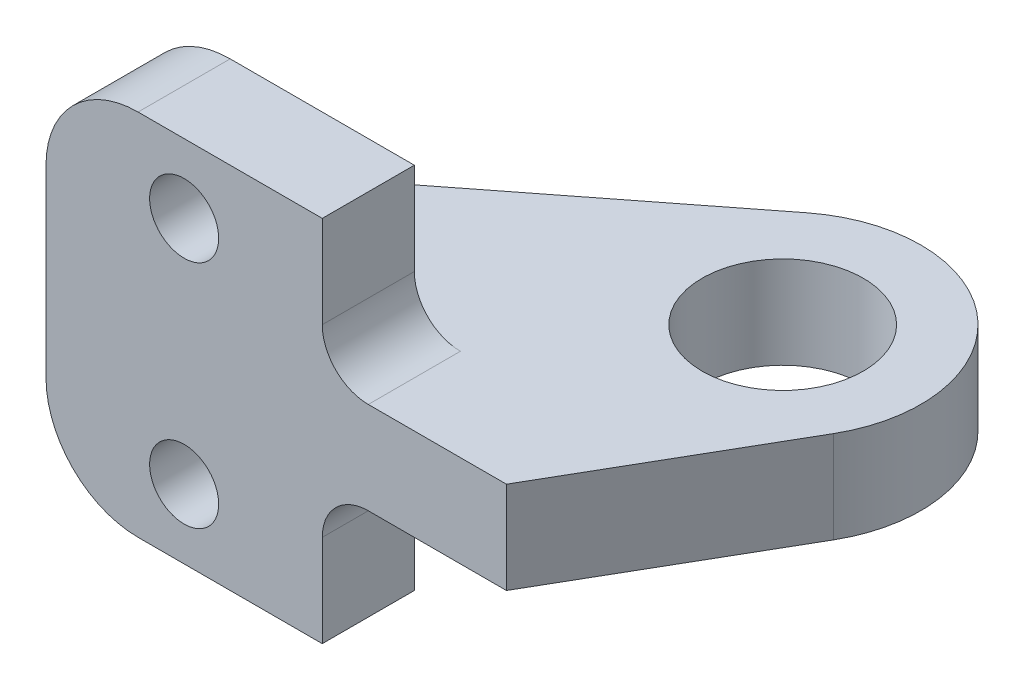
ISO-10303-21;
HEADER;
FILE_DESCRIPTION(('STEP AP214'),'2;1');
FILE_NAME('part.step','',(''),(''),'','','');
FILE_SCHEMA(('AUTOMOTIVE_DESIGN { 1 0 10303 214 1 1 1 1 }'));
ENDSEC;
DATA;
#1=APPLICATION_CONTEXT('core data for automotive mechanical design processes');
#2=APPLICATION_PROTOCOL_DEFINITION('international standard','automotive_design',2000,#1);
#3=PRODUCT_CONTEXT('',#1,'mechanical');
#4=PRODUCT('Part','Part','',(#3));
#5=PRODUCT_RELATED_PRODUCT_CATEGORY('part','',(#4));
#6=PRODUCT_DEFINITION_FORMATION('','',#4);
#7=PRODUCT_DEFINITION_CONTEXT('part definition',#1,'design');
#8=PRODUCT_DEFINITION('design','',#6,#7);
#9=PRODUCT_DEFINITION_SHAPE('','',#8);
#10=(LENGTH_UNIT() NAMED_UNIT(*) SI_UNIT(.MILLI.,.METRE.));
#11=(NAMED_UNIT(*) PLANE_ANGLE_UNIT() SI_UNIT($,.RADIAN.));
#12=(NAMED_UNIT(*) SI_UNIT($,.STERADIAN.) SOLID_ANGLE_UNIT());
#13=UNCERTAINTY_MEASURE_WITH_UNIT(LENGTH_MEASURE(1.E-05),#10,'distance_accuracy_value','');
#14=(GEOMETRIC_REPRESENTATION_CONTEXT(3) GLOBAL_UNCERTAINTY_ASSIGNED_CONTEXT((#13)) GLOBAL_UNIT_ASSIGNED_CONTEXT((#10,
#11,#12)) REPRESENTATION_CONTEXT('',''));
#15=CARTESIAN_POINT('',(0.,0.,0.));
#16=DIRECTION('',(0.,0.,1.));
#17=DIRECTION('',(1.,0.,0.));
#18=AXIS2_PLACEMENT_3D('',#15,#16,#17);
#19=CARTESIAN_POINT('',(0.,12.7,0.));
#20=DIRECTION('',(0.,0.,-1.));
#21=DIRECTION('',(-1.,0.,0.));
#22=AXIS2_PLACEMENT_3D('',#19,#20,#21);
#23=PLANE('',#22);
#24=CARTESIAN_POINT('',(38.1,-31.75,0.));
#25=DIRECTION('',(0.,0.,-1.));
#26=DIRECTION('',(-1.,0.,0.));
#27=AXIS2_PLACEMENT_3D('',#24,#25,#26);
#28=CIRCLE('',#27,9.525);
#29=CARTESIAN_POINT('',(28.575,-31.75,0.));
#30=VERTEX_POINT('',#29);
#31=EDGE_CURVE('E176',#30,#30,#28,.T.);
#32=ORIENTED_EDGE('',*,*,#31,.T.);
#33=EDGE_LOOP('',(#32));
#34=FACE_BOUND('',#33,.T.);
#35=CARTESIAN_POINT('',(38.1,31.75,0.));
#36=DIRECTION('',(0.,0.,-1.));
#37=DIRECTION('',(-1.,0.,0.));
#38=AXIS2_PLACEMENT_3D('',#35,#36,#37);
#39=CIRCLE('',#38,9.525);
#40=CARTESIAN_POINT('',(28.575,31.75,0.));
#41=VERTEX_POINT('',#40);
#42=EDGE_CURVE('E199',#41,#41,#39,.T.);
#43=ORIENTED_EDGE('',*,*,#42,.T.);
#44=EDGE_LOOP('',(#43));
#45=FACE_BOUND('',#44,.T.);
#46=DIRECTION('',(0.,-1.,0.));
#47=VECTOR('',#46,1.);
#48=CARTESIAN_POINT('',(0.,12.7,0.));
#49=LINE('',#48,#47);
#50=CARTESIAN_POINT('',(0.,25.4,0.));
#51=VERTEX_POINT('',#50);
#52=CARTESIAN_POINT('',(0.,-25.4,0.));
#53=VERTEX_POINT('',#52);
#54=EDGE_CURVE('E283',#51,#53,#49,.T.);
#55=ORIENTED_EDGE('',*,*,#54,.T.);
#56=CARTESIAN_POINT('',(25.4,-25.4,0.));
#57=DIRECTION('',(0.,0.,-1.));
#58=DIRECTION('',(-1.,0.,0.));
#59=AXIS2_PLACEMENT_3D('',#56,#57,#58);
#60=CIRCLE('',#59,25.4);
#61=CARTESIAN_POINT('',(25.4,-50.8,0.));
#62=VERTEX_POINT('',#61);
#63=EDGE_CURVE('E11',#53,#62,#60,.F.);
#64=ORIENTED_EDGE('',*,*,#63,.T.);
#65=DIRECTION('',(-1.,0.,0.));
#66=VECTOR('',#65,1.);
#67=CARTESIAN_POINT('',(0.,-50.8,0.));
#68=LINE('',#67,#66);
#69=CARTESIAN_POINT('',(76.2,-50.8,0.));
#70=VERTEX_POINT('',#69);
#71=EDGE_CURVE('E165',#70,#62,#68,.T.);
#72=ORIENTED_EDGE('',*,*,#71,.F.);
#73=DIRECTION('',(0.,-1.,0.));
#74=VECTOR('',#73,1.);
#75=CARTESIAN_POINT('',(76.2,0.,0.));
#76=LINE('',#75,#74);
#77=CARTESIAN_POINT('',(76.2,-25.4,0.));
#78=VERTEX_POINT('',#77);
#79=EDGE_CURVE('E146',#78,#70,#76,.T.);
#80=ORIENTED_EDGE('',*,*,#79,.F.);
#81=CARTESIAN_POINT('',(88.9,-25.4,0.));
#82=DIRECTION('',(0.,0.,-1.));
#83=DIRECTION('',(-1.,0.,0.));
#84=AXIS2_PLACEMENT_3D('',#81,#82,#83);
#85=CIRCLE('',#84,12.7);
#86=CARTESIAN_POINT('',(88.9,-12.7,0.));
#87=VERTEX_POINT('',#86);
#88=EDGE_CURVE('E155',#78,#87,#85,.T.);
#89=ORIENTED_EDGE('',*,*,#88,.T.);
#90=DIRECTION('',(1.,0.,0.));
#91=VECTOR('',#90,1.);
#92=CARTESIAN_POINT('',(0.,-12.7,0.));
#93=LINE('',#92,#91);
#94=CARTESIAN_POINT('',(127.,-12.7,0.));
#95=VERTEX_POINT('',#94);
#96=EDGE_CURVE('E274',#87,#95,#93,.T.);
#97=ORIENTED_EDGE('',*,*,#96,.T.);
#98=DIRECTION('',(0.,-1.,0.));
#99=VECTOR('',#98,1.);
#100=CARTESIAN_POINT('',(127.,12.7,0.));
#101=LINE('',#100,#99);
#102=CARTESIAN_POINT('',(127.,12.7,0.));
#103=VERTEX_POINT('',#102);
#104=EDGE_CURVE('E262',#103,#95,#101,.T.);
#105=ORIENTED_EDGE('',*,*,#104,.F.);
#106=DIRECTION('',(1.,0.,0.));
#107=VECTOR('',#106,1.);
#108=CARTESIAN_POINT('',(0.,12.7,0.));
#109=LINE('',#108,#107);
#110=CARTESIAN_POINT('',(88.9,12.7,0.));
#111=VERTEX_POINT('',#110);
#112=EDGE_CURVE('E255',#111,#103,#109,.T.);
#113=ORIENTED_EDGE('',*,*,#112,.F.);
#114=CARTESIAN_POINT('',(88.9,25.4,0.));
#115=DIRECTION('',(0.,0.,-1.));
#116=DIRECTION('',(-1.,0.,0.));
#117=AXIS2_PLACEMENT_3D('',#114,#115,#116);
#118=CIRCLE('',#117,12.7);
#119=CARTESIAN_POINT('',(76.2,25.4,0.));
#120=VERTEX_POINT('',#119);
#121=EDGE_CURVE('E204',#111,#120,#118,.T.);
#122=ORIENTED_EDGE('',*,*,#121,.T.);
#123=DIRECTION('',(0.,1.,0.));
#124=VECTOR('',#123,1.);
#125=CARTESIAN_POINT('',(76.2,0.,0.));
#126=LINE('',#125,#124);
#127=CARTESIAN_POINT('',(76.2,50.8,0.));
#128=VERTEX_POINT('',#127);
#129=EDGE_CURVE('E208',#120,#128,#126,.T.);
#130=ORIENTED_EDGE('',*,*,#129,.T.);
#131=DIRECTION('',(1.,0.,0.));
#132=VECTOR('',#131,1.);
#133=CARTESIAN_POINT('',(0.,50.8,0.));
#134=LINE('',#133,#132);
#135=CARTESIAN_POINT('',(25.4,50.8,0.));
#136=VERTEX_POINT('',#135);
#137=EDGE_CURVE('E229',#136,#128,#134,.T.);
#138=ORIENTED_EDGE('',*,*,#137,.F.);
#139=CARTESIAN_POINT('',(25.4,25.4,0.));
#140=DIRECTION('',(0.,0.,-1.));
#141=DIRECTION('',(-1.,0.,0.));
#142=AXIS2_PLACEMENT_3D('',#139,#140,#141);
#143=CIRCLE('',#142,25.4);
#144=EDGE_CURVE('E301',#136,#51,#143,.F.);
#145=ORIENTED_EDGE('',*,*,#144,.T.);
#146=EDGE_LOOP('',(#55,#64,#72,#80,#89,#97,#105,#113,#122,#130,#138,#145));
#147=FACE_BOUND('',#146,.T.);
#148=ADVANCED_FACE('F41',(#34,#45,#147),#23,.F.);
#149=CARTESIAN_POINT('',(0.,-50.8,-25.4));
#150=DIRECTION('',(0.,0.,1.));
#151=DIRECTION('',(1.,0.,0.));
#152=AXIS2_PLACEMENT_3D('',#149,#150,#151);
#153=PLANE('',#152);
#154=CARTESIAN_POINT('',(38.1,-31.75,-25.4));
#155=DIRECTION('',(0.,0.,-1.));
#156=DIRECTION('',(-1.,0.,0.));
#157=AXIS2_PLACEMENT_3D('',#154,#155,#156);
#158=CIRCLE('',#157,9.525);
#159=CARTESIAN_POINT('',(28.575,-31.75,-25.4));
#160=VERTEX_POINT('',#159);
#161=EDGE_CURVE('E172',#160,#160,#158,.T.);
#162=ORIENTED_EDGE('',*,*,#161,.F.);
#163=EDGE_LOOP('',(#162));
#164=FACE_BOUND('',#163,.T.);
#165=DIRECTION('',(1.,0.,0.));
#166=VECTOR('',#165,1.);
#167=CARTESIAN_POINT('',(0.,-50.8,-25.4));
#168=LINE('',#167,#166);
#169=CARTESIAN_POINT('',(25.4,-50.8,-25.4));
#170=VERTEX_POINT('',#169);
#171=CARTESIAN_POINT('',(76.2,-50.8,-25.4));
#172=VERTEX_POINT('',#171);
#173=EDGE_CURVE('E184',#170,#172,#168,.T.);
#174=ORIENTED_EDGE('',*,*,#173,.F.);
#175=CARTESIAN_POINT('',(25.4,-25.4,-25.4));
#176=DIRECTION('',(0.,0.,1.));
#177=DIRECTION('',(1.,0.,0.));
#178=AXIS2_PLACEMENT_3D('',#175,#176,#177);
#179=CIRCLE('',#178,25.4);
#180=CARTESIAN_POINT('',(0.,-25.4,-25.4));
#181=VERTEX_POINT('',#180);
#182=EDGE_CURVE('E64',#170,#181,#179,.F.);
#183=ORIENTED_EDGE('',*,*,#182,.T.);
#184=DIRECTION('',(0.,1.,0.));
#185=VECTOR('',#184,1.);
#186=CARTESIAN_POINT('',(0.,-50.8,-25.4));
#187=LINE('',#186,#185);
#188=CARTESIAN_POINT('',(0.,-12.7,-25.4));
#189=VERTEX_POINT('',#188);
#190=EDGE_CURVE('E189',#181,#189,#187,.T.);
#191=ORIENTED_EDGE('',*,*,#190,.T.);
#192=DIRECTION('',(1.,0.,0.));
#193=VECTOR('',#192,1.);
#194=CARTESIAN_POINT('',(0.,-12.7,-25.4));
#195=LINE('',#194,#193);
#196=CARTESIAN_POINT('',(88.9,-12.7,-25.4));
#197=VERTEX_POINT('',#196);
#198=EDGE_CURVE('E181',#189,#197,#195,.T.);
#199=ORIENTED_EDGE('',*,*,#198,.T.);
#200=CARTESIAN_POINT('',(88.9,-25.4,-25.4));
#201=DIRECTION('',(0.,0.,-1.));
#202=DIRECTION('',(-1.,0.,0.));
#203=AXIS2_PLACEMENT_3D('',#200,#201,#202);
#204=CIRCLE('',#203,12.7);
#205=CARTESIAN_POINT('',(76.2,-25.4,-25.4));
#206=VERTEX_POINT('',#205);
#207=EDGE_CURVE('E167',#206,#197,#204,.T.);
#208=ORIENTED_EDGE('',*,*,#207,.F.);
#209=DIRECTION('',(0.,-1.,0.));
#210=VECTOR('',#209,1.);
#211=CARTESIAN_POINT('',(76.2,0.,-25.4));
#212=LINE('',#211,#210);
#213=EDGE_CURVE('E149',#206,#172,#212,.T.);
#214=ORIENTED_EDGE('',*,*,#213,.T.);
#215=EDGE_LOOP('',(#174,#183,#191,#199,#208,#214));
#216=FACE_BOUND('',#215,.T.);
#217=ADVANCED_FACE('F321',(#164,#216),#153,.F.);
#218=CARTESIAN_POINT('',(0.,-50.8,0.));
#219=DIRECTION('',(0.,1.,0.));
#220=DIRECTION('',(0.,0.,1.));
#221=AXIS2_PLACEMENT_3D('',#218,#219,#220);
#222=PLANE('',#221);
#223=ORIENTED_EDGE('',*,*,#71,.T.);
#224=DIRECTION('',(0.,0.,-1.));
#225=VECTOR('',#224,1.);
#226=CARTESIAN_POINT('',(25.4,-50.8,-25.4));
#227=LINE('',#226,#225);
#228=EDGE_CURVE('E310',#62,#170,#227,.T.);
#229=ORIENTED_EDGE('',*,*,#228,.T.);
#230=ORIENTED_EDGE('',*,*,#173,.T.);
#231=DIRECTION('',(0.,0.,-1.));
#232=VECTOR('',#231,1.);
#233=CARTESIAN_POINT('',(76.2,-50.8,0.));
#234=LINE('',#233,#232);
#235=EDGE_CURVE('E178',#70,#172,#234,.T.);
#236=ORIENTED_EDGE('',*,*,#235,.F.);
#237=EDGE_LOOP('',(#223,#229,#230,#236));
#238=FACE_BOUND('',#237,.T.);
#239=ADVANCED_FACE('F318',(#238),#222,.F.);
#240=CARTESIAN_POINT('',(0.,-12.7,0.));
#241=DIRECTION('',(0.,1.,0.));
#242=DIRECTION('',(0.,0.,1.));
#243=AXIS2_PLACEMENT_3D('',#240,#241,#242);
#244=PLANE('',#243);
#245=CARTESIAN_POINT('',(127.,-12.7,-76.2));
#246=DIRECTION('',(0.,1.,0.));
#247=DIRECTION('',(0.,0.,1.));
#248=AXIS2_PLACEMENT_3D('',#245,#246,#247);
#249=CIRCLE('',#248,22.225);
#250=CARTESIAN_POINT('',(127.,-12.7,-53.975));
#251=VERTEX_POINT('',#250);
#252=EDGE_CURVE('E248',#251,#251,#249,.T.);
#253=ORIENTED_EDGE('',*,*,#252,.T.);
#254=EDGE_LOOP('',(#253));
#255=FACE_BOUND('',#254,.T.);
#256=ORIENTED_EDGE('',*,*,#96,.F.);
#257=DIRECTION('',(0.,0.,-1.));
#258=VECTOR('',#257,1.);
#259=CARTESIAN_POINT('',(88.9,-12.7,0.));
#260=LINE('',#259,#258);
#261=EDGE_CURVE('E154',#87,#197,#260,.T.);
#262=ORIENTED_EDGE('',*,*,#261,.T.);
#263=ORIENTED_EDGE('',*,*,#198,.F.);
#264=DIRECTION('',(0.788282795930052,0.,-0.615313118372021));
#265=VECTOR('',#264,1.);
#266=CARTESIAN_POINT('',(-12.3200349311975,-12.7,-15.7833000655262));
#267=LINE('',#266,#265);
#268=CARTESIAN_POINT('',(103.556570190026,-12.7,-106.233574524935));
#269=VERTEX_POINT('',#268);
#270=EDGE_CURVE('E270',#189,#269,#267,.T.);
#271=ORIENTED_EDGE('',*,*,#270,.T.);
#272=CARTESIAN_POINT('',(127.,-12.7,-76.2));
#273=DIRECTION('',(0.,1.,0.));
#274=DIRECTION('',(0.,0.,1.));
#275=AXIS2_PLACEMENT_3D('',#272,#273,#274);
#276=CIRCLE('',#275,38.1);
#277=CARTESIAN_POINT('',(159.995567884187,-12.7,-57.15));
#278=VERTEX_POINT('',#277);
#279=EDGE_CURVE('E266',#278,#269,#276,.T.);
#280=ORIENTED_EDGE('',*,*,#279,.F.);
#281=DIRECTION('',(0.5,0.,-0.866025403784439));
#282=VECTOR('',#281,1.);
#283=CARTESIAN_POINT('',(95.25,-12.7,54.9926131403119));
#284=LINE('',#283,#282);
#285=EDGE_CURVE('E242',#95,#278,#284,.T.);
#286=ORIENTED_EDGE('',*,*,#285,.F.);
#287=EDGE_LOOP('',(#256,#262,#263,#271,#280,#286));
#288=FACE_BOUND('',#287,.T.);
#289=ADVANCED_FACE('F324',(#255,#288),#244,.F.);
#290=CARTESIAN_POINT('',(95.25,12.7,54.9926131403119));
#291=DIRECTION('',(-0.866025403784439,0.,-0.5));
#292=DIRECTION('',(-0.5,0.,0.866025403784439));
#293=AXIS2_PLACEMENT_3D('',#290,#291,#292);
#294=PLANE('',#293);
#295=ORIENTED_EDGE('',*,*,#285,.T.);
#296=DIRECTION('',(0.,-1.,0.));
#297=VECTOR('',#296,1.);
#298=CARTESIAN_POINT('',(159.995567884187,12.7,-57.15));
#299=LINE('',#298,#297);
#300=CARTESIAN_POINT('',(159.995567884187,12.7,-57.15));
#301=VERTEX_POINT('',#300);
#302=EDGE_CURVE('E293',#301,#278,#299,.T.);
#303=ORIENTED_EDGE('',*,*,#302,.F.);
#304=DIRECTION('',(0.5,0.,-0.866025403784439));
#305=VECTOR('',#304,1.);
#306=CARTESIAN_POINT('',(95.25,12.7,54.9926131403119));
#307=LINE('',#306,#305);
#308=EDGE_CURVE('E243',#103,#301,#307,.T.);
#309=ORIENTED_EDGE('',*,*,#308,.F.);
#310=ORIENTED_EDGE('',*,*,#104,.T.);
#311=EDGE_LOOP('',(#295,#303,#309,#310));
#312=FACE_BOUND('',#311,.T.);
#313=ADVANCED_FACE('F338',(#312),#294,.F.);
#314=CARTESIAN_POINT('',(127.,12.7,-76.2));
#315=DIRECTION('',(0.,-1.,0.));
#316=DIRECTION('',(0.,0.,-1.));
#317=AXIS2_PLACEMENT_3D('',#314,#315,#316);
#318=CYLINDRICAL_SURFACE('',#317,38.1);
#319=ORIENTED_EDGE('',*,*,#279,.T.);
#320=DIRECTION('',(0.,-1.,0.));
#321=VECTOR('',#320,1.);
#322=CARTESIAN_POINT('',(103.556570190026,12.7,-106.233574524935));
#323=LINE('',#322,#321);
#324=CARTESIAN_POINT('',(103.556570190026,12.7,-106.233574524935));
#325=VERTEX_POINT('',#324);
#326=EDGE_CURVE('E290',#325,#269,#323,.T.);
#327=ORIENTED_EDGE('',*,*,#326,.F.);
#328=CARTESIAN_POINT('',(127.,12.7,-76.2));
#329=DIRECTION('',(0.,1.,0.));
#330=DIRECTION('',(0.,0.,1.));
#331=AXIS2_PLACEMENT_3D('',#328,#329,#330);
#332=CIRCLE('',#331,38.1);
#333=EDGE_CURVE('E247',#301,#325,#332,.T.);
#334=ORIENTED_EDGE('',*,*,#333,.F.);
#335=ORIENTED_EDGE('',*,*,#302,.T.);
#336=EDGE_LOOP('',(#319,#327,#334,#335));
#337=FACE_BOUND('',#336,.T.);
#338=ADVANCED_FACE('F334',(#337),#318,.T.);
#339=CARTESIAN_POINT('',(-12.3200349311975,12.7,-15.7833000655262));
#340=DIRECTION('',(-0.615313118372021,0.,-0.788282795930052));
#341=DIRECTION('',(-0.788282795930052,0.,0.615313118372021));
#342=AXIS2_PLACEMENT_3D('',#339,#340,#341);
#343=PLANE('',#342);
#344=ORIENTED_EDGE('',*,*,#270,.F.);
#345=DIRECTION('',(0.,-1.,0.));
#346=VECTOR('',#345,1.);
#347=CARTESIAN_POINT('',(0.,12.7,-25.4));
#348=LINE('',#347,#346);
#349=CARTESIAN_POINT('',(0.,12.7,-25.4));
#350=VERTEX_POINT('',#349);
#351=EDGE_CURVE('E286',#350,#189,#348,.T.);
#352=ORIENTED_EDGE('',*,*,#351,.F.);
#353=DIRECTION('',(0.788282795930052,0.,-0.615313118372021));
#354=VECTOR('',#353,1.);
#355=CARTESIAN_POINT('',(-12.3200349311975,12.7,-15.7833000655262));
#356=LINE('',#355,#354);
#357=EDGE_CURVE('E251',#350,#325,#356,.T.);
#358=ORIENTED_EDGE('',*,*,#357,.T.);
#359=ORIENTED_EDGE('',*,*,#326,.T.);
#360=EDGE_LOOP('',(#344,#352,#358,#359));
#361=FACE_BOUND('',#360,.T.);
#362=ADVANCED_FACE('F331',(#361),#343,.T.);
#363=CARTESIAN_POINT('',(0.,12.7,0.));
#364=DIRECTION('',(-1.,0.,0.));
#365=DIRECTION('',(0.,0.,1.));
#366=AXIS2_PLACEMENT_3D('',#363,#364,#365);
#367=PLANE('',#366);
#368=ORIENTED_EDGE('',*,*,#190,.F.);
#369=DIRECTION('',(0.,0.,-1.));
#370=VECTOR('',#369,1.);
#371=CARTESIAN_POINT('',(0.,-25.4,0.));
#372=LINE('',#371,#370);
#373=EDGE_CURVE('E50',#181,#53,#372,.F.);
#374=ORIENTED_EDGE('',*,*,#373,.T.);
#375=ORIENTED_EDGE('',*,*,#54,.F.);
#376=DIRECTION('',(0.,0.,1.));
#377=VECTOR('',#376,1.);
#378=CARTESIAN_POINT('',(0.,25.4,0.));
#379=LINE('',#378,#377);
#380=CARTESIAN_POINT('',(0.,25.4,-25.4));
#381=VERTEX_POINT('',#380);
#382=EDGE_CURVE('E304',#51,#381,#379,.F.);
#383=ORIENTED_EDGE('',*,*,#382,.T.);
#384=DIRECTION('',(0.,-1.,0.));
#385=VECTOR('',#384,1.);
#386=CARTESIAN_POINT('',(0.,50.8,-25.4));
#387=LINE('',#386,#385);
#388=EDGE_CURVE('E236',#381,#350,#387,.T.);
#389=ORIENTED_EDGE('',*,*,#388,.T.);
#390=ORIENTED_EDGE('',*,*,#351,.T.);
#391=EDGE_LOOP('',(#368,#374,#375,#383,#389,#390));
#392=FACE_BOUND('',#391,.T.);
#393=ADVANCED_FACE('F327',(#392),#367,.T.);
#394=CARTESIAN_POINT('',(127.,12.7,-76.2));
#395=DIRECTION('',(0.,-1.,0.));
#396=DIRECTION('',(0.,0.,-1.));
#397=AXIS2_PLACEMENT_3D('',#394,#395,#396);
#398=CYLINDRICAL_SURFACE('',#397,22.225);
#399=CARTESIAN_POINT('',(127.,12.7,-76.2));
#400=DIRECTION('',(0.,1.,0.));
#401=DIRECTION('',(0.,0.,1.));
#402=AXIS2_PLACEMENT_3D('',#399,#400,#401);
#403=CIRCLE('',#402,22.225);
#404=CARTESIAN_POINT('',(127.,12.7,-53.975));
#405=VERTEX_POINT('',#404);
#406=EDGE_CURVE('E258',#405,#405,#403,.T.);
#407=ORIENTED_EDGE('',*,*,#406,.T.);
#408=EDGE_LOOP('',(#407));
#409=FACE_BOUND('',#408,.T.);
#410=ORIENTED_EDGE('',*,*,#252,.F.);
#411=EDGE_LOOP('',(#410));
#412=FACE_BOUND('',#411,.T.);
#413=ADVANCED_FACE('F374',(#409,#412),#398,.F.);
#414=CARTESIAN_POINT('',(0.,12.7,0.));
#415=DIRECTION('',(0.,1.,0.));
#416=DIRECTION('',(0.,0.,1.));
#417=AXIS2_PLACEMENT_3D('',#414,#415,#416);
#418=PLANE('',#417);
#419=DIRECTION('',(-1.,0.,0.));
#420=VECTOR('',#419,1.);
#421=CARTESIAN_POINT('',(0.,12.7,-25.4));
#422=LINE('',#421,#420);
#423=CARTESIAN_POINT('',(88.9,12.7,-25.4));
#424=VERTEX_POINT('',#423);
#425=EDGE_CURVE('E223',#424,#350,#422,.T.);
#426=ORIENTED_EDGE('',*,*,#425,.F.);
#427=DIRECTION('',(0.,0.,-1.));
#428=VECTOR('',#427,1.);
#429=CARTESIAN_POINT('',(88.9,12.7,0.));
#430=LINE('',#429,#428);
#431=EDGE_CURVE('E213',#111,#424,#430,.T.);
#432=ORIENTED_EDGE('',*,*,#431,.F.);
#433=ORIENTED_EDGE('',*,*,#112,.T.);
#434=ORIENTED_EDGE('',*,*,#308,.T.);
#435=ORIENTED_EDGE('',*,*,#333,.T.);
#436=ORIENTED_EDGE('',*,*,#357,.F.);
#437=EDGE_LOOP('',(#426,#432,#433,#434,#435,#436));
#438=FACE_BOUND('',#437,.T.);
#439=ORIENTED_EDGE('',*,*,#406,.F.);
#440=EDGE_LOOP('',(#439));
#441=FACE_BOUND('',#440,.T.);
#442=ADVANCED_FACE('F345',(#438,#441),#418,.T.);
#443=CARTESIAN_POINT('',(0.,50.8,-25.4));
#444=DIRECTION('',(0.,0.,1.));
#445=DIRECTION('',(1.,0.,0.));
#446=AXIS2_PLACEMENT_3D('',#443,#444,#445);
#447=PLANE('',#446);
#448=CARTESIAN_POINT('',(38.1,31.75,-25.4));
#449=DIRECTION('',(0.,0.,-1.));
#450=DIRECTION('',(-1.,0.,0.));
#451=AXIS2_PLACEMENT_3D('',#448,#449,#450);
#452=CIRCLE('',#451,9.525);
#453=CARTESIAN_POINT('',(28.575,31.75,-25.4));
#454=VERTEX_POINT('',#453);
#455=EDGE_CURVE('E195',#454,#454,#452,.T.);
#456=ORIENTED_EDGE('',*,*,#455,.F.);
#457=EDGE_LOOP('',(#456));
#458=FACE_BOUND('',#457,.T.);
#459=ORIENTED_EDGE('',*,*,#388,.F.);
#460=CARTESIAN_POINT('',(25.4,25.4,-25.4));
#461=DIRECTION('',(0.,0.,1.));
#462=DIRECTION('',(1.,0.,0.));
#463=AXIS2_PLACEMENT_3D('',#460,#461,#462);
#464=CIRCLE('',#463,25.4);
#465=CARTESIAN_POINT('',(25.4,50.8,-25.4));
#466=VERTEX_POINT('',#465);
#467=EDGE_CURVE('E307',#381,#466,#464,.F.);
#468=ORIENTED_EDGE('',*,*,#467,.T.);
#469=DIRECTION('',(-1.,0.,0.));
#470=VECTOR('',#469,1.);
#471=CARTESIAN_POINT('',(0.,50.8,-25.4));
#472=LINE('',#471,#470);
#473=CARTESIAN_POINT('',(76.2,50.8,-25.4));
#474=VERTEX_POINT('',#473);
#475=EDGE_CURVE('E232',#474,#466,#472,.T.);
#476=ORIENTED_EDGE('',*,*,#475,.F.);
#477=DIRECTION('',(0.,1.,0.));
#478=VECTOR('',#477,1.);
#479=CARTESIAN_POINT('',(76.2,0.,-25.4));
#480=LINE('',#479,#478);
#481=CARTESIAN_POINT('',(76.2,25.4,-25.4));
#482=VERTEX_POINT('',#481);
#483=EDGE_CURVE('E209',#482,#474,#480,.T.);
#484=ORIENTED_EDGE('',*,*,#483,.F.);
#485=CARTESIAN_POINT('',(88.9,25.4,-25.4));
#486=DIRECTION('',(0.,0.,-1.));
#487=DIRECTION('',(-1.,0.,0.));
#488=AXIS2_PLACEMENT_3D('',#485,#486,#487);
#489=CIRCLE('',#488,12.7);
#490=EDGE_CURVE('E203',#424,#482,#489,.T.);
#491=ORIENTED_EDGE('',*,*,#490,.F.);
#492=ORIENTED_EDGE('',*,*,#425,.T.);
#493=EDGE_LOOP('',(#459,#468,#476,#484,#491,#492));
#494=FACE_BOUND('',#493,.T.);
#495=ADVANCED_FACE('F365',(#458,#494),#447,.F.);
#496=CARTESIAN_POINT('',(0.,50.8,0.));
#497=DIRECTION('',(0.,1.,0.));
#498=DIRECTION('',(0.,0.,1.));
#499=AXIS2_PLACEMENT_3D('',#496,#497,#498);
#500=PLANE('',#499);
#501=ORIENTED_EDGE('',*,*,#475,.T.);
#502=DIRECTION('',(0.,0.,1.));
#503=VECTOR('',#502,1.);
#504=CARTESIAN_POINT('',(25.4,50.8,0.));
#505=LINE('',#504,#503);
#506=EDGE_CURVE('E297',#466,#136,#505,.T.);
#507=ORIENTED_EDGE('',*,*,#506,.T.);
#508=ORIENTED_EDGE('',*,*,#137,.T.);
#509=DIRECTION('',(0.,0.,-1.));
#510=VECTOR('',#509,1.);
#511=CARTESIAN_POINT('',(76.2,50.8,0.));
#512=LINE('',#511,#510);
#513=EDGE_CURVE('E219',#128,#474,#512,.T.);
#514=ORIENTED_EDGE('',*,*,#513,.T.);
#515=EDGE_LOOP('',(#501,#507,#508,#514));
#516=FACE_BOUND('',#515,.T.);
#517=ADVANCED_FACE('F357',(#516),#500,.T.);
#518=CARTESIAN_POINT('',(76.2,0.,0.));
#519=DIRECTION('',(-1.,0.,0.));
#520=DIRECTION('',(0.,-1.,0.));
#521=AXIS2_PLACEMENT_3D('',#518,#519,#520);
#522=PLANE('',#521);
#523=ORIENTED_EDGE('',*,*,#483,.T.);
#524=ORIENTED_EDGE('',*,*,#513,.F.);
#525=ORIENTED_EDGE('',*,*,#129,.F.);
#526=DIRECTION('',(0.,0.,-1.));
#527=VECTOR('',#526,1.);
#528=CARTESIAN_POINT('',(76.2,25.4,0.));
#529=LINE('',#528,#527);
#530=EDGE_CURVE('E224',#120,#482,#529,.T.);
#531=ORIENTED_EDGE('',*,*,#530,.T.);
#532=EDGE_LOOP('',(#523,#524,#525,#531));
#533=FACE_BOUND('',#532,.T.);
#534=ADVANCED_FACE('F354',(#533),#522,.F.);
#535=CARTESIAN_POINT('',(88.9,25.4,0.));
#536=DIRECTION('',(0.,0.,-1.));
#537=DIRECTION('',(-1.,0.,0.));
#538=AXIS2_PLACEMENT_3D('',#535,#536,#537);
#539=CYLINDRICAL_SURFACE('',#538,12.7);
#540=ORIENTED_EDGE('',*,*,#490,.T.);
#541=ORIENTED_EDGE('',*,*,#530,.F.);
#542=ORIENTED_EDGE('',*,*,#121,.F.);
#543=ORIENTED_EDGE('',*,*,#431,.T.);
#544=EDGE_LOOP('',(#540,#541,#542,#543));
#545=FACE_BOUND('',#544,.T.);
#546=ADVANCED_FACE('F349',(#545),#539,.F.);
#547=CARTESIAN_POINT('',(38.1,31.75,12.7));
#548=DIRECTION('',(0.,0.,-1.));
#549=DIRECTION('',(-1.,0.,0.));
#550=AXIS2_PLACEMENT_3D('',#547,#548,#549);
#551=CYLINDRICAL_SURFACE('',#550,9.525);
#552=CARTESIAN_POINT('',(28.575,31.75,-25.4));
#553=CARTESIAN_POINT('',(28.575,31.75,-25.1354166666667));
#554=CARTESIAN_POINT('',(28.575,31.75,-24.8708333333333));
#555=CARTESIAN_POINT('',(28.575,31.75,-24.3416666666667));
#556=CARTESIAN_POINT('',(28.575,31.75,-24.0770833333333));
#557=CARTESIAN_POINT('',(28.575,31.75,-23.5479166666667));
#558=CARTESIAN_POINT('',(28.575,31.75,-23.2833333333333));
#559=CARTESIAN_POINT('',(28.575,31.75,-22.7541666666667));
#560=CARTESIAN_POINT('',(28.575,31.75,-22.4895833333333));
#561=CARTESIAN_POINT('',(28.575,31.75,-21.9604166666667));
#562=CARTESIAN_POINT('',(28.575,31.75,-21.6958333333333));
#563=CARTESIAN_POINT('',(28.575,31.75,-21.1666666666667));
#564=CARTESIAN_POINT('',(28.575,31.75,-20.9020833333333));
#565=CARTESIAN_POINT('',(28.575,31.75,-20.3729166666667));
#566=CARTESIAN_POINT('',(28.575,31.75,-20.1083333333333));
#567=CARTESIAN_POINT('',(28.575,31.75,-19.5791666666667));
#568=CARTESIAN_POINT('',(28.575,31.75,-19.3145833333333));
#569=CARTESIAN_POINT('',(28.575,31.75,-18.7854166666667));
#570=CARTESIAN_POINT('',(28.575,31.75,-18.5208333333333));
#571=CARTESIAN_POINT('',(28.575,31.75,-17.9916666666667));
#572=CARTESIAN_POINT('',(28.575,31.75,-17.7270833333333));
#573=CARTESIAN_POINT('',(28.575,31.75,-17.1979166666667));
#574=CARTESIAN_POINT('',(28.575,31.75,-16.9333333333333));
#575=CARTESIAN_POINT('',(28.575,31.75,-16.4041666666667));
#576=CARTESIAN_POINT('',(28.575,31.75,-16.1395833333333));
#577=CARTESIAN_POINT('',(28.575,31.75,-15.6104166666667));
#578=CARTESIAN_POINT('',(28.575,31.75,-15.3458333333333));
#579=CARTESIAN_POINT('',(28.575,31.75,-14.8166666666667));
#580=CARTESIAN_POINT('',(28.575,31.75,-14.5520833333333));
#581=CARTESIAN_POINT('',(28.575,31.75,-14.0229166666667));
#582=CARTESIAN_POINT('',(28.575,31.75,-13.7583333333333));
#583=CARTESIAN_POINT('',(28.575,31.75,-13.2291666666667));
#584=CARTESIAN_POINT('',(28.575,31.75,-12.9645833333333));
#585=CARTESIAN_POINT('',(28.575,31.75,-12.4354166666667));
#586=CARTESIAN_POINT('',(28.575,31.75,-12.1708333333333));
#587=CARTESIAN_POINT('',(28.575,31.75,-11.6416666666667));
#588=CARTESIAN_POINT('',(28.575,31.75,-11.3770833333333));
#589=CARTESIAN_POINT('',(28.575,31.75,-10.8479166666667));
#590=CARTESIAN_POINT('',(28.575,31.75,-10.5833333333333));
#591=CARTESIAN_POINT('',(28.575,31.75,-10.0541666666667));
#592=CARTESIAN_POINT('',(28.575,31.75,-9.78958333333333));
#593=CARTESIAN_POINT('',(28.575,31.75,-9.26041666666666));
#594=CARTESIAN_POINT('',(28.575,31.75,-8.99583333333333));
#595=CARTESIAN_POINT('',(28.575,31.75,-8.46666666666667));
#596=CARTESIAN_POINT('',(28.575,31.75,-8.20208333333333));
#597=CARTESIAN_POINT('',(28.575,31.75,-7.67291666666666));
#598=CARTESIAN_POINT('',(28.575,31.75,-7.40833333333333));
#599=CARTESIAN_POINT('',(28.575,31.75,-6.87916666666666));
#600=CARTESIAN_POINT('',(28.575,31.75,-6.61458333333333));
#601=CARTESIAN_POINT('',(28.575,31.75,-6.08541666666667));
#602=CARTESIAN_POINT('',(28.575,31.75,-5.82083333333333));
#603=CARTESIAN_POINT('',(28.575,31.75,-5.29166666666667));
#604=CARTESIAN_POINT('',(28.575,31.75,-5.02708333333333));
#605=CARTESIAN_POINT('',(28.575,31.75,-4.49791666666667));
#606=CARTESIAN_POINT('',(28.575,31.75,-4.23333333333333));
#607=CARTESIAN_POINT('',(28.575,31.75,-3.70416666666666));
#608=CARTESIAN_POINT('',(28.575,31.75,-3.43958333333333));
#609=CARTESIAN_POINT('',(28.575,31.75,-2.91041666666667));
#610=CARTESIAN_POINT('',(28.575,31.75,-2.64583333333333));
#611=CARTESIAN_POINT('',(28.575,31.75,-2.11666666666667));
#612=CARTESIAN_POINT('',(28.575,31.75,-1.85208333333333));
#613=CARTESIAN_POINT('',(28.575,31.75,-1.32291666666666));
#614=CARTESIAN_POINT('',(28.575,31.75,-1.05833333333333));
#615=CARTESIAN_POINT('',(28.575,31.75,-0.529166666666665));
#616=CARTESIAN_POINT('',(28.575,31.75,-0.264583333333332));
#617=CARTESIAN_POINT('',(28.575,31.75,0.));
#618=B_SPLINE_CURVE_WITH_KNOTS('',3,(#552,#553,#554,#555,#556,#557,#558,#559,#560,#561,#562,
#563,#564,#565,#566,#567,#568,#569,#570,#571,#572,#573,#574,#575,#576,#577,#578,#579,#580,#581,
#582,#583,#584,#585,#586,#587,#588,#589,#590,#591,#592,#593,#594,#595,#596,#597,#598,#599,#600,
#601,#602,#603,#604,#605,#606,#607,#608,#609,#610,#611,#612,#613,#614,#615,#616,#617),
.UNSPECIFIED.,.F.,.F.,(4,2,2,2,2,2,2,2,2,2,2,2,2,2,2,2,2,2,2,2,2,2,2,2,2,2,2,2,2,2,2,2,4),(0.,
0.793750000000003,1.5875,2.38125,3.175,3.96875,4.7625,5.55625,6.35,7.14375,7.9375,8.73125,9.525,
10.31875,11.1125,11.90625,12.7,13.49375,14.2875,15.08125,15.875,16.66875,17.4625,18.25625,19.05,
19.84375,20.6375,21.43125,22.225,23.01875,23.8125,24.60625,25.4),.UNSPECIFIED.);
#619=EDGE_CURVE('BSEAM398',#454,#41,#618,.T.);
#620=ORIENTED_EDGE('',*,*,#455,.T.);
#621=ORIENTED_EDGE('',*,*,#42,.F.);
#622=ORIENTED_EDGE('',*,*,#619,.T.);
#623=ORIENTED_EDGE('',*,*,#619,.F.);
#624=EDGE_LOOP('',(#620,#622,#621,#623));
#625=FACE_BOUND('',#624,.T.);
#626=ADVANCED_FACE('F398',(#625),#551,.F.);
#627=CARTESIAN_POINT('',(25.4,25.4,0.));
#628=DIRECTION('',(0.,0.,1.));
#629=DIRECTION('',(1.,0.,0.));
#630=AXIS2_PLACEMENT_3D('',#627,#628,#629);
#631=CYLINDRICAL_SURFACE('',#630,25.4);
#632=ORIENTED_EDGE('',*,*,#467,.F.);
#633=ORIENTED_EDGE('',*,*,#382,.F.);
#634=ORIENTED_EDGE('',*,*,#144,.F.);
#635=ORIENTED_EDGE('',*,*,#506,.F.);
#636=EDGE_LOOP('',(#632,#633,#634,#635));
#637=FACE_BOUND('',#636,.T.);
#638=ADVANCED_FACE('F362',(#637),#631,.T.);
#639=CARTESIAN_POINT('',(76.2,0.,0.));
#640=DIRECTION('',(1.,0.,0.));
#641=DIRECTION('',(0.,1.,0.));
#642=AXIS2_PLACEMENT_3D('',#639,#640,#641);
#643=PLANE('',#642);
#644=ORIENTED_EDGE('',*,*,#213,.F.);
#645=DIRECTION('',(0.,0.,-1.));
#646=VECTOR('',#645,1.);
#647=CARTESIAN_POINT('',(76.2,-25.4,0.));
#648=LINE('',#647,#646);
#649=EDGE_CURVE('E141',#78,#206,#648,.T.);
#650=ORIENTED_EDGE('',*,*,#649,.F.);
#651=ORIENTED_EDGE('',*,*,#79,.T.);
#652=ORIENTED_EDGE('',*,*,#235,.T.);
#653=EDGE_LOOP('',(#644,#650,#651,#652));
#654=FACE_BOUND('',#653,.T.);
#655=ADVANCED_FACE('F143',(#654),#643,.T.);
#656=CARTESIAN_POINT('',(88.9,-25.4,0.));
#657=DIRECTION('',(0.,0.,-1.));
#658=DIRECTION('',(-1.,0.,0.));
#659=AXIS2_PLACEMENT_3D('',#656,#657,#658);
#660=CYLINDRICAL_SURFACE('',#659,12.7);
#661=ORIENTED_EDGE('',*,*,#207,.T.);
#662=ORIENTED_EDGE('',*,*,#261,.F.);
#663=ORIENTED_EDGE('',*,*,#88,.F.);
#664=ORIENTED_EDGE('',*,*,#649,.T.);
#665=EDGE_LOOP('',(#661,#662,#663,#664));
#666=FACE_BOUND('',#665,.T.);
#667=ADVANCED_FACE('F159',(#666),#660,.F.);
#668=CARTESIAN_POINT('',(38.1,-31.75,0.));
#669=DIRECTION('',(0.,0.,-1.));
#670=DIRECTION('',(-1.,0.,0.));
#671=AXIS2_PLACEMENT_3D('',#668,#669,#670);
#672=CYLINDRICAL_SURFACE('',#671,9.525);
#673=ORIENTED_EDGE('',*,*,#31,.F.);
#674=EDGE_LOOP('',(#673));
#675=FACE_BOUND('',#674,.T.);
#676=ORIENTED_EDGE('',*,*,#161,.T.);
#677=EDGE_LOOP('',(#676));
#678=FACE_BOUND('',#677,.T.);
#679=ADVANCED_FACE('F475',(#675,#678),#672,.F.);
#680=CARTESIAN_POINT('',(25.4,-25.4,0.));
#681=DIRECTION('',(0.,0.,1.));
#682=DIRECTION('',(1.,0.,0.));
#683=AXIS2_PLACEMENT_3D('',#680,#681,#682);
#684=CYLINDRICAL_SURFACE('',#683,25.4);
#685=ORIENTED_EDGE('',*,*,#63,.F.);
#686=ORIENTED_EDGE('',*,*,#373,.F.);
#687=ORIENTED_EDGE('',*,*,#182,.F.);
#688=ORIENTED_EDGE('',*,*,#228,.F.);
#689=EDGE_LOOP('',(#685,#686,#687,#688));
#690=FACE_BOUND('',#689,.T.);
#691=ADVANCED_FACE('F43',(#690),#684,.T.);
#692=CLOSED_SHELL('',(#148,#217,#239,#289,#313,#338,#362,#393,#413,#442,#495,#517,#534,#546,
#626,#638,#655,#667,#679,#691));
#693=MANIFOLD_SOLID_BREP('B2',#692);
#694=ADVANCED_BREP_SHAPE_REPRESENTATION('',(#18,#693),#14);
#695=SHAPE_DEFINITION_REPRESENTATION(#9,#694);
ENDSEC;
END-ISO-10303-21;
